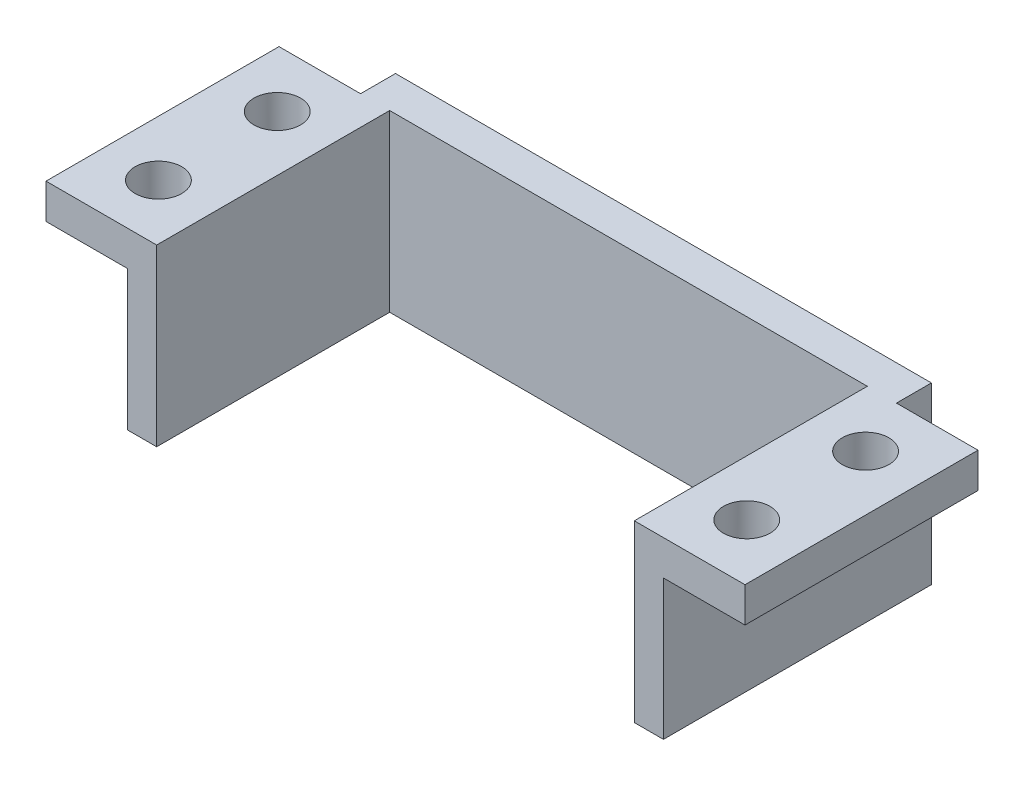
ISO-10303-21;
HEADER;
FILE_DESCRIPTION(('STEP AP214'),'2;1');
FILE_NAME('part.step','',(''),(''),'','','');
FILE_SCHEMA(('AUTOMOTIVE_DESIGN { 1 0 10303 214 1 1 1 1 }'));
ENDSEC;
DATA;
#1=APPLICATION_CONTEXT('core data for automotive mechanical design processes');
#2=APPLICATION_PROTOCOL_DEFINITION('international standard','automotive_design',2000,#1);
#3=PRODUCT_CONTEXT('',#1,'mechanical');
#4=PRODUCT('Part','Part','',(#3));
#5=PRODUCT_RELATED_PRODUCT_CATEGORY('part','',(#4));
#6=PRODUCT_DEFINITION_FORMATION('','',#4);
#7=PRODUCT_DEFINITION_CONTEXT('part definition',#1,'design');
#8=PRODUCT_DEFINITION('design','',#6,#7);
#9=PRODUCT_DEFINITION_SHAPE('','',#8);
#10=(LENGTH_UNIT() NAMED_UNIT(*) SI_UNIT(.MILLI.,.METRE.));
#11=(NAMED_UNIT(*) PLANE_ANGLE_UNIT() SI_UNIT($,.RADIAN.));
#12=(NAMED_UNIT(*) SI_UNIT($,.STERADIAN.) SOLID_ANGLE_UNIT());
#13=UNCERTAINTY_MEASURE_WITH_UNIT(LENGTH_MEASURE(1.E-05),#10,'distance_accuracy_value','');
#14=(GEOMETRIC_REPRESENTATION_CONTEXT(3) GLOBAL_UNCERTAINTY_ASSIGNED_CONTEXT((#13)) GLOBAL_UNIT_ASSIGNED_CONTEXT((#10,
#11,#12)) REPRESENTATION_CONTEXT('',''));
#15=CARTESIAN_POINT('',(0.,0.,0.));
#16=DIRECTION('',(0.,0.,1.));
#17=DIRECTION('',(1.,0.,0.));
#18=AXIS2_PLACEMENT_3D('',#15,#16,#17);
#19=CARTESIAN_POINT('',(0.,0.,3.));
#20=DIRECTION('',(1.,0.,0.));
#21=DIRECTION('',(0.,0.,-1.));
#22=AXIS2_PLACEMENT_3D('',#19,#20,#21);
#23=PLANE('',#22);
#24=DIRECTION('',(0.,0.,1.));
#25=VECTOR('',#24,1.);
#26=CARTESIAN_POINT('',(0.,12.,23.));
#27=LINE('',#26,#25);
#28=CARTESIAN_POINT('',(0.,12.,3.));
#29=VERTEX_POINT('',#28);
#30=CARTESIAN_POINT('',(0.,12.,23.));
#31=VERTEX_POINT('',#30);
#32=EDGE_CURVE('E203',#29,#31,#27,.T.);
#33=ORIENTED_EDGE('',*,*,#32,.F.);
#34=DIRECTION('',(0.,-1.,0.));
#35=VECTOR('',#34,1.);
#36=CARTESIAN_POINT('',(0.,15.,3.));
#37=LINE('',#36,#35);
#38=CARTESIAN_POINT('',(0.,15.,3.));
#39=VERTEX_POINT('',#38);
#40=EDGE_CURVE('E210',#39,#29,#37,.T.);
#41=ORIENTED_EDGE('',*,*,#40,.F.);
#42=DIRECTION('',(0.,0.,-1.));
#43=VECTOR('',#42,1.);
#44=CARTESIAN_POINT('',(0.,15.,3.));
#45=LINE('',#44,#43);
#46=CARTESIAN_POINT('',(0.,15.,0.));
#47=VERTEX_POINT('',#46);
#48=EDGE_CURVE('E246',#39,#47,#45,.T.);
#49=ORIENTED_EDGE('',*,*,#48,.T.);
#50=DIRECTION('',(0.,-1.,0.));
#51=VECTOR('',#50,1.);
#52=CARTESIAN_POINT('',(0.,0.,0.));
#53=LINE('',#52,#51);
#54=CARTESIAN_POINT('',(0.,0.,0.));
#55=VERTEX_POINT('',#54);
#56=EDGE_CURVE('E241',#47,#55,#53,.T.);
#57=ORIENTED_EDGE('',*,*,#56,.T.);
#58=DIRECTION('',(0.,0.,-1.));
#59=VECTOR('',#58,1.);
#60=CARTESIAN_POINT('',(0.,0.,3.));
#61=LINE('',#60,#59);
#62=CARTESIAN_POINT('',(0.,0.,23.));
#63=VERTEX_POINT('',#62);
#64=EDGE_CURVE('E11',#63,#55,#61,.T.);
#65=ORIENTED_EDGE('',*,*,#64,.F.);
#66=DIRECTION('',(0.,-1.,0.));
#67=VECTOR('',#66,1.);
#68=CARTESIAN_POINT('',(0.,0.,23.));
#69=LINE('',#68,#67);
#70=EDGE_CURVE('E225',#31,#63,#69,.T.);
#71=ORIENTED_EDGE('',*,*,#70,.F.);
#72=EDGE_LOOP('',(#33,#41,#49,#57,#65,#71));
#73=FACE_BOUND('',#72,.T.);
#74=ADVANCED_FACE('F39',(#73),#23,.F.);
#75=CARTESIAN_POINT('',(0.,0.,3.));
#76=DIRECTION('',(0.,0.,-1.));
#77=DIRECTION('',(-1.,0.,0.));
#78=AXIS2_PLACEMENT_3D('',#75,#76,#77);
#79=PLANE('',#78);
#80=DIRECTION('',(1.,0.,0.));
#81=VECTOR('',#80,1.);
#82=CARTESIAN_POINT('',(0.,0.,3.));
#83=LINE('',#82,#81);
#84=CARTESIAN_POINT('',(2.5,0.,3.));
#85=VERTEX_POINT('',#84);
#86=CARTESIAN_POINT('',(43.5,0.,3.));
#87=VERTEX_POINT('',#86);
#88=EDGE_CURVE('E63',#85,#87,#83,.T.);
#89=ORIENTED_EDGE('',*,*,#88,.T.);
#90=DIRECTION('',(0.,1.,0.));
#91=VECTOR('',#90,1.);
#92=CARTESIAN_POINT('',(43.5,0.,3.));
#93=LINE('',#92,#91);
#94=CARTESIAN_POINT('',(43.5,15.,3.));
#95=VERTEX_POINT('',#94);
#96=EDGE_CURVE('E150',#87,#95,#93,.T.);
#97=ORIENTED_EDGE('',*,*,#96,.T.);
#98=DIRECTION('',(-1.,0.,0.));
#99=VECTOR('',#98,1.);
#100=CARTESIAN_POINT('',(0.,15.,3.));
#101=LINE('',#100,#99);
#102=CARTESIAN_POINT('',(2.5,15.,3.));
#103=VERTEX_POINT('',#102);
#104=EDGE_CURVE('E243',#95,#103,#101,.T.);
#105=ORIENTED_EDGE('',*,*,#104,.T.);
#106=DIRECTION('',(0.,1.,0.));
#107=VECTOR('',#106,1.);
#108=CARTESIAN_POINT('',(2.5,0.,3.));
#109=LINE('',#108,#107);
#110=EDGE_CURVE('E224',#85,#103,#109,.T.);
#111=ORIENTED_EDGE('',*,*,#110,.F.);
#112=EDGE_LOOP('',(#89,#97,#105,#111));
#113=FACE_BOUND('',#112,.T.);
#114=ADVANCED_FACE('F295',(#113),#79,.F.);
#115=CARTESIAN_POINT('',(0.,0.,3.));
#116=DIRECTION('',(0.,1.,0.));
#117=DIRECTION('',(0.,0.,1.));
#118=AXIS2_PLACEMENT_3D('',#115,#116,#117);
#119=PLANE('',#118);
#120=DIRECTION('',(1.,0.,0.));
#121=VECTOR('',#120,1.);
#122=CARTESIAN_POINT('',(0.,0.,0.));
#123=LINE('',#122,#121);
#124=CARTESIAN_POINT('',(46.,0.,0.));
#125=VERTEX_POINT('',#124);
#126=EDGE_CURVE('E249',#55,#125,#123,.T.);
#127=ORIENTED_EDGE('',*,*,#126,.T.);
#128=DIRECTION('',(0.,0.,-1.));
#129=VECTOR('',#128,1.);
#130=CARTESIAN_POINT('',(46.,0.,3.));
#131=LINE('',#130,#129);
#132=CARTESIAN_POINT('',(46.,0.,23.));
#133=VERTEX_POINT('',#132);
#134=EDGE_CURVE('E47',#133,#125,#131,.T.);
#135=ORIENTED_EDGE('',*,*,#134,.F.);
#136=DIRECTION('',(-1.,0.,0.));
#137=VECTOR('',#136,1.);
#138=CARTESIAN_POINT('',(46.,0.,23.));
#139=LINE('',#138,#137);
#140=CARTESIAN_POINT('',(43.5,0.,23.));
#141=VERTEX_POINT('',#140);
#142=EDGE_CURVE('E183',#133,#141,#139,.T.);
#143=ORIENTED_EDGE('',*,*,#142,.T.);
#144=DIRECTION('',(0.,0.,-1.));
#145=VECTOR('',#144,1.);
#146=CARTESIAN_POINT('',(43.5,0.,23.));
#147=LINE('',#146,#145);
#148=EDGE_CURVE('E186',#141,#87,#147,.T.);
#149=ORIENTED_EDGE('',*,*,#148,.T.);
#150=ORIENTED_EDGE('',*,*,#88,.F.);
#151=DIRECTION('',(0.,0.,-1.));
#152=VECTOR('',#151,1.);
#153=CARTESIAN_POINT('',(2.5,0.,23.));
#154=LINE('',#153,#152);
#155=CARTESIAN_POINT('',(2.5,0.,23.));
#156=VERTEX_POINT('',#155);
#157=EDGE_CURVE('E238',#156,#85,#154,.T.);
#158=ORIENTED_EDGE('',*,*,#157,.F.);
#159=DIRECTION('',(1.,0.,0.));
#160=VECTOR('',#159,1.);
#161=CARTESIAN_POINT('',(0.,0.,23.));
#162=LINE('',#161,#160);
#163=EDGE_CURVE('E227',#63,#156,#162,.T.);
#164=ORIENTED_EDGE('',*,*,#163,.F.);
#165=ORIENTED_EDGE('',*,*,#64,.T.);
#166=EDGE_LOOP('',(#127,#135,#143,#149,#150,#158,#164,#165));
#167=FACE_BOUND('',#166,.T.);
#168=ADVANCED_FACE('F302',(#167),#119,.F.);
#169=CARTESIAN_POINT('',(46.,0.,3.));
#170=DIRECTION('',(-1.,0.,0.));
#171=DIRECTION('',(0.,0.,1.));
#172=AXIS2_PLACEMENT_3D('',#169,#170,#171);
#173=PLANE('',#172);
#174=DIRECTION('',(0.,0.,-1.));
#175=VECTOR('',#174,1.);
#176=CARTESIAN_POINT('',(46.,15.,3.));
#177=LINE('',#176,#175);
#178=CARTESIAN_POINT('',(46.,15.,3.));
#179=VERTEX_POINT('',#178);
#180=CARTESIAN_POINT('',(46.,15.,0.));
#181=VERTEX_POINT('',#180);
#182=EDGE_CURVE('E257',#179,#181,#177,.T.);
#183=ORIENTED_EDGE('',*,*,#182,.F.);
#184=DIRECTION('',(0.,-1.,0.));
#185=VECTOR('',#184,1.);
#186=CARTESIAN_POINT('',(46.,15.,3.));
#187=LINE('',#186,#185);
#188=CARTESIAN_POINT('',(46.,12.,3.));
#189=VERTEX_POINT('',#188);
#190=EDGE_CURVE('E161',#179,#189,#187,.T.);
#191=ORIENTED_EDGE('',*,*,#190,.T.);
#192=DIRECTION('',(0.,0.,1.));
#193=VECTOR('',#192,1.);
#194=CARTESIAN_POINT('',(46.,12.,23.));
#195=LINE('',#194,#193);
#196=CARTESIAN_POINT('',(46.,12.,23.));
#197=VERTEX_POINT('',#196);
#198=EDGE_CURVE('E171',#189,#197,#195,.T.);
#199=ORIENTED_EDGE('',*,*,#198,.T.);
#200=DIRECTION('',(0.,-1.,0.));
#201=VECTOR('',#200,1.);
#202=CARTESIAN_POINT('',(46.,0.,23.));
#203=LINE('',#202,#201);
#204=EDGE_CURVE('E149',#197,#133,#203,.T.);
#205=ORIENTED_EDGE('',*,*,#204,.T.);
#206=ORIENTED_EDGE('',*,*,#134,.T.);
#207=DIRECTION('',(0.,1.,0.));
#208=VECTOR('',#207,1.);
#209=CARTESIAN_POINT('',(46.,0.,0.));
#210=LINE('',#209,#208);
#211=EDGE_CURVE('E251',#125,#181,#210,.T.);
#212=ORIENTED_EDGE('',*,*,#211,.T.);
#213=EDGE_LOOP('',(#183,#191,#199,#205,#206,#212));
#214=FACE_BOUND('',#213,.T.);
#215=ADVANCED_FACE('F344',(#214),#173,.F.);
#216=CARTESIAN_POINT('',(0.,15.,3.));
#217=DIRECTION('',(0.,-1.,0.));
#218=DIRECTION('',(0.,0.,-1.));
#219=AXIS2_PLACEMENT_3D('',#216,#217,#218);
#220=PLANE('',#219);
#221=CARTESIAN_POINT('',(48.25,15.,18.1));
#222=DIRECTION('',(0.,-1.,0.));
#223=DIRECTION('',(0.,0.,1.));
#224=AXIS2_PLACEMENT_3D('',#221,#222,#223);
#225=CIRCLE('',#224,2.);
#226=CARTESIAN_POINT('',(48.25,15.,20.1));
#227=VERTEX_POINT('',#226);
#228=EDGE_CURVE('E266',#227,#227,#225,.T.);
#229=ORIENTED_EDGE('',*,*,#228,.T.);
#230=EDGE_LOOP('',(#229));
#231=FACE_BOUND('',#230,.T.);
#232=CARTESIAN_POINT('',(48.25,15.,7.9));
#233=DIRECTION('',(0.,-1.,0.));
#234=DIRECTION('',(0.,0.,-1.));
#235=AXIS2_PLACEMENT_3D('',#232,#233,#234);
#236=CIRCLE('',#235,2.);
#237=CARTESIAN_POINT('',(48.25,15.,5.9));
#238=VERTEX_POINT('',#237);
#239=EDGE_CURVE('E271',#238,#238,#236,.T.);
#240=ORIENTED_EDGE('',*,*,#239,.T.);
#241=EDGE_LOOP('',(#240));
#242=FACE_BOUND('',#241,.T.);
#243=CARTESIAN_POINT('',(-2.25,15.,18.1));
#244=DIRECTION('',(0.,1.,0.));
#245=DIRECTION('',(0.,0.,1.));
#246=AXIS2_PLACEMENT_3D('',#243,#244,#245);
#247=CIRCLE('',#246,2.);
#248=CARTESIAN_POINT('',(-2.25,15.,20.1));
#249=VERTEX_POINT('',#248);
#250=EDGE_CURVE('E193',#249,#249,#247,.T.);
#251=ORIENTED_EDGE('',*,*,#250,.F.);
#252=EDGE_LOOP('',(#251));
#253=FACE_BOUND('',#252,.T.);
#254=CARTESIAN_POINT('',(-2.25,15.,7.9));
#255=DIRECTION('',(0.,1.,0.));
#256=DIRECTION('',(0.,0.,-1.));
#257=AXIS2_PLACEMENT_3D('',#254,#255,#256);
#258=CIRCLE('',#257,2.);
#259=CARTESIAN_POINT('',(-2.25,15.,5.9));
#260=VERTEX_POINT('',#259);
#261=EDGE_CURVE('E192',#260,#260,#258,.T.);
#262=ORIENTED_EDGE('',*,*,#261,.F.);
#263=EDGE_LOOP('',(#262));
#264=FACE_BOUND('',#263,.T.);
#265=DIRECTION('',(-1.,0.,0.));
#266=VECTOR('',#265,1.);
#267=CARTESIAN_POINT('',(0.,15.,0.));
#268=LINE('',#267,#266);
#269=EDGE_CURVE('E244',#181,#47,#268,.T.);
#270=ORIENTED_EDGE('',*,*,#269,.T.);
#271=ORIENTED_EDGE('',*,*,#48,.F.);
#272=DIRECTION('',(1.,0.,0.));
#273=VECTOR('',#272,1.);
#274=CARTESIAN_POINT('',(-7.,15.,3.));
#275=LINE('',#274,#273);
#276=CARTESIAN_POINT('',(-7.,15.,3.));
#277=VERTEX_POINT('',#276);
#278=EDGE_CURVE('E221',#277,#39,#275,.T.);
#279=ORIENTED_EDGE('',*,*,#278,.F.);
#280=DIRECTION('',(0.,0.,-1.));
#281=VECTOR('',#280,1.);
#282=CARTESIAN_POINT('',(-7.,15.,23.));
#283=LINE('',#282,#281);
#284=CARTESIAN_POINT('',(-7.,15.,23.));
#285=VERTEX_POINT('',#284);
#286=EDGE_CURVE('E202',#285,#277,#283,.T.);
#287=ORIENTED_EDGE('',*,*,#286,.F.);
#288=DIRECTION('',(-1.,0.,0.));
#289=VECTOR('',#288,1.);
#290=CARTESIAN_POINT('',(0.,15.,23.));
#291=LINE('',#290,#289);
#292=CARTESIAN_POINT('',(2.5,15.,23.));
#293=VERTEX_POINT('',#292);
#294=EDGE_CURVE('E231',#293,#285,#291,.T.);
#295=ORIENTED_EDGE('',*,*,#294,.F.);
#296=DIRECTION('',(0.,0.,-1.));
#297=VECTOR('',#296,1.);
#298=CARTESIAN_POINT('',(2.5,15.,23.));
#299=LINE('',#298,#297);
#300=EDGE_CURVE('E233',#293,#103,#299,.T.);
#301=ORIENTED_EDGE('',*,*,#300,.T.);
#302=ORIENTED_EDGE('',*,*,#104,.F.);
#303=DIRECTION('',(0.,0.,-1.));
#304=VECTOR('',#303,1.);
#305=CARTESIAN_POINT('',(43.5,15.,23.));
#306=LINE('',#305,#304);
#307=CARTESIAN_POINT('',(43.5,15.,23.));
#308=VERTEX_POINT('',#307);
#309=EDGE_CURVE('E189',#308,#95,#306,.T.);
#310=ORIENTED_EDGE('',*,*,#309,.F.);
#311=DIRECTION('',(1.,0.,0.));
#312=VECTOR('',#311,1.);
#313=CARTESIAN_POINT('',(46.,15.,23.));
#314=LINE('',#313,#312);
#315=CARTESIAN_POINT('',(53.,15.,23.));
#316=VERTEX_POINT('',#315);
#317=EDGE_CURVE('E178',#308,#316,#314,.T.);
#318=ORIENTED_EDGE('',*,*,#317,.T.);
#319=DIRECTION('',(0.,0.,-1.));
#320=VECTOR('',#319,1.);
#321=CARTESIAN_POINT('',(53.,15.,23.));
#322=LINE('',#321,#320);
#323=CARTESIAN_POINT('',(53.,15.,3.));
#324=VERTEX_POINT('',#323);
#325=EDGE_CURVE('E160',#316,#324,#322,.T.);
#326=ORIENTED_EDGE('',*,*,#325,.T.);
#327=DIRECTION('',(-1.,0.,0.));
#328=VECTOR('',#327,1.);
#329=CARTESIAN_POINT('',(53.,15.,3.));
#330=LINE('',#329,#328);
#331=EDGE_CURVE('E170',#324,#179,#330,.T.);
#332=ORIENTED_EDGE('',*,*,#331,.T.);
#333=ORIENTED_EDGE('',*,*,#182,.T.);
#334=EDGE_LOOP('',(#270,#271,#279,#287,#295,#301,#302,#310,#318,#326,#332,#333));
#335=FACE_BOUND('',#334,.T.);
#336=ADVANCED_FACE('F278',(#231,#242,#253,#264,#335),#220,.F.);
#337=CARTESIAN_POINT('',(0.,0.,0.));
#338=DIRECTION('',(0.,0.,-1.));
#339=DIRECTION('',(-1.,0.,0.));
#340=AXIS2_PLACEMENT_3D('',#337,#338,#339);
#341=PLANE('',#340);
#342=ORIENTED_EDGE('',*,*,#56,.F.);
#343=ORIENTED_EDGE('',*,*,#269,.F.);
#344=ORIENTED_EDGE('',*,*,#211,.F.);
#345=ORIENTED_EDGE('',*,*,#126,.F.);
#346=EDGE_LOOP('',(#342,#343,#344,#345));
#347=FACE_BOUND('',#346,.T.);
#348=ADVANCED_FACE('F325',(#347),#341,.T.);
#349=CARTESIAN_POINT('',(2.5,0.,23.));
#350=DIRECTION('',(-1.,0.,0.));
#351=DIRECTION('',(0.,0.,1.));
#352=AXIS2_PLACEMENT_3D('',#349,#350,#351);
#353=PLANE('',#352);
#354=ORIENTED_EDGE('',*,*,#110,.T.);
#355=ORIENTED_EDGE('',*,*,#300,.F.);
#356=DIRECTION('',(0.,1.,0.));
#357=VECTOR('',#356,1.);
#358=CARTESIAN_POINT('',(2.5,0.,23.));
#359=LINE('',#358,#357);
#360=EDGE_CURVE('E229',#156,#293,#359,.T.);
#361=ORIENTED_EDGE('',*,*,#360,.F.);
#362=ORIENTED_EDGE('',*,*,#157,.T.);
#363=EDGE_LOOP('',(#354,#355,#361,#362));
#364=FACE_BOUND('',#363,.T.);
#365=ADVANCED_FACE('F335',(#364),#353,.F.);
#366=CARTESIAN_POINT('',(0.,0.,23.));
#367=DIRECTION('',(0.,0.,-1.));
#368=DIRECTION('',(-1.,0.,0.));
#369=AXIS2_PLACEMENT_3D('',#366,#367,#368);
#370=PLANE('',#369);
#371=ORIENTED_EDGE('',*,*,#294,.T.);
#372=DIRECTION('',(0.,1.,0.));
#373=VECTOR('',#372,1.);
#374=CARTESIAN_POINT('',(-7.,15.,23.));
#375=LINE('',#374,#373);
#376=CARTESIAN_POINT('',(-7.,12.,23.));
#377=VERTEX_POINT('',#376);
#378=EDGE_CURVE('E199',#377,#285,#375,.T.);
#379=ORIENTED_EDGE('',*,*,#378,.F.);
#380=DIRECTION('',(1.,0.,0.));
#381=VECTOR('',#380,1.);
#382=CARTESIAN_POINT('',(-7.,12.,23.));
#383=LINE('',#382,#381);
#384=EDGE_CURVE('E209',#377,#31,#383,.T.);
#385=ORIENTED_EDGE('',*,*,#384,.T.);
#386=ORIENTED_EDGE('',*,*,#70,.T.);
#387=ORIENTED_EDGE('',*,*,#163,.T.);
#388=ORIENTED_EDGE('',*,*,#360,.T.);
#389=EDGE_LOOP('',(#371,#379,#385,#386,#387,#388));
#390=FACE_BOUND('',#389,.T.);
#391=ADVANCED_FACE('F332',(#390),#370,.F.);
#392=CARTESIAN_POINT('',(-7.,15.,3.));
#393=DIRECTION('',(0.,0.,1.));
#394=DIRECTION('',(1.,0.,0.));
#395=AXIS2_PLACEMENT_3D('',#392,#393,#394);
#396=PLANE('',#395);
#397=ORIENTED_EDGE('',*,*,#40,.T.);
#398=DIRECTION('',(1.,0.,0.));
#399=VECTOR('',#398,1.);
#400=CARTESIAN_POINT('',(-7.,12.,3.));
#401=LINE('',#400,#399);
#402=CARTESIAN_POINT('',(-7.,12.,3.));
#403=VERTEX_POINT('',#402);
#404=EDGE_CURVE('E218',#403,#29,#401,.T.);
#405=ORIENTED_EDGE('',*,*,#404,.F.);
#406=DIRECTION('',(0.,-1.,0.));
#407=VECTOR('',#406,1.);
#408=CARTESIAN_POINT('',(-7.,15.,3.));
#409=LINE('',#408,#407);
#410=EDGE_CURVE('E205',#277,#403,#409,.T.);
#411=ORIENTED_EDGE('',*,*,#410,.F.);
#412=ORIENTED_EDGE('',*,*,#278,.T.);
#413=EDGE_LOOP('',(#397,#405,#411,#412));
#414=FACE_BOUND('',#413,.T.);
#415=ADVANCED_FACE('F310',(#414),#396,.F.);
#416=CARTESIAN_POINT('',(-7.,12.,23.));
#417=DIRECTION('',(0.,1.,0.));
#418=DIRECTION('',(0.,0.,1.));
#419=AXIS2_PLACEMENT_3D('',#416,#417,#418);
#420=PLANE('',#419);
#421=CARTESIAN_POINT('',(-2.25,12.,18.1));
#422=DIRECTION('',(0.,1.,0.));
#423=DIRECTION('',(0.,0.,1.));
#424=AXIS2_PLACEMENT_3D('',#421,#422,#423);
#425=CIRCLE('',#424,2.);
#426=CARTESIAN_POINT('',(-2.25,12.,20.1));
#427=VERTEX_POINT('',#426);
#428=EDGE_CURVE('E213',#427,#427,#425,.T.);
#429=ORIENTED_EDGE('',*,*,#428,.T.);
#430=EDGE_LOOP('',(#429));
#431=FACE_BOUND('',#430,.T.);
#432=CARTESIAN_POINT('',(-2.25,12.,7.9));
#433=DIRECTION('',(0.,1.,0.));
#434=DIRECTION('',(0.,0.,1.));
#435=AXIS2_PLACEMENT_3D('',#432,#433,#434);
#436=CIRCLE('',#435,2.);
#437=CARTESIAN_POINT('',(-2.25,12.,9.9));
#438=VERTEX_POINT('',#437);
#439=EDGE_CURVE('E196',#438,#438,#436,.T.);
#440=ORIENTED_EDGE('',*,*,#439,.T.);
#441=EDGE_LOOP('',(#440));
#442=FACE_BOUND('',#441,.T.);
#443=ORIENTED_EDGE('',*,*,#32,.T.);
#444=ORIENTED_EDGE('',*,*,#384,.F.);
#445=DIRECTION('',(0.,0.,1.));
#446=VECTOR('',#445,1.);
#447=CARTESIAN_POINT('',(-7.,12.,23.));
#448=LINE('',#447,#446);
#449=EDGE_CURVE('E207',#403,#377,#448,.T.);
#450=ORIENTED_EDGE('',*,*,#449,.F.);
#451=ORIENTED_EDGE('',*,*,#404,.T.);
#452=EDGE_LOOP('',(#443,#444,#450,#451));
#453=FACE_BOUND('',#452,.T.);
#454=ADVANCED_FACE('F314',(#431,#442,#453),#420,.F.);
#455=CARTESIAN_POINT('',(-7.,0.,0.));
#456=DIRECTION('',(1.,0.,0.));
#457=DIRECTION('',(0.,0.,-1.));
#458=AXIS2_PLACEMENT_3D('',#455,#456,#457);
#459=PLANE('',#458);
#460=ORIENTED_EDGE('',*,*,#378,.T.);
#461=ORIENTED_EDGE('',*,*,#286,.T.);
#462=ORIENTED_EDGE('',*,*,#410,.T.);
#463=ORIENTED_EDGE('',*,*,#449,.T.);
#464=EDGE_LOOP('',(#460,#461,#462,#463));
#465=FACE_BOUND('',#464,.T.);
#466=ADVANCED_FACE('F317',(#465),#459,.F.);
#467=CARTESIAN_POINT('',(-2.25,8.,7.9));
#468=DIRECTION('',(0.,1.,0.));
#469=DIRECTION('',(0.,0.,1.));
#470=AXIS2_PLACEMENT_3D('',#467,#468,#469);
#471=CYLINDRICAL_SURFACE('',#470,2.);
#472=ORIENTED_EDGE('',*,*,#261,.T.);
#473=EDGE_LOOP('',(#472));
#474=FACE_BOUND('',#473,.T.);
#475=ORIENTED_EDGE('',*,*,#439,.F.);
#476=EDGE_LOOP('',(#475));
#477=FACE_BOUND('',#476,.T.);
#478=ADVANCED_FACE('F364',(#474,#477),#471,.F.);
#479=CARTESIAN_POINT('',(-2.25,8.,18.1));
#480=DIRECTION('',(0.,1.,0.));
#481=DIRECTION('',(0.,0.,1.));
#482=AXIS2_PLACEMENT_3D('',#479,#480,#481);
#483=CYLINDRICAL_SURFACE('',#482,2.);
#484=ORIENTED_EDGE('',*,*,#250,.T.);
#485=EDGE_LOOP('',(#484));
#486=FACE_BOUND('',#485,.T.);
#487=ORIENTED_EDGE('',*,*,#428,.F.);
#488=EDGE_LOOP('',(#487));
#489=FACE_BOUND('',#488,.T.);
#490=ADVANCED_FACE('F367',(#486,#489),#483,.F.);
#491=CARTESIAN_POINT('',(43.5,0.,23.));
#492=DIRECTION('',(-1.,0.,0.));
#493=DIRECTION('',(0.,0.,1.));
#494=AXIS2_PLACEMENT_3D('',#491,#492,#493);
#495=PLANE('',#494);
#496=ORIENTED_EDGE('',*,*,#96,.F.);
#497=ORIENTED_EDGE('',*,*,#148,.F.);
#498=DIRECTION('',(0.,1.,0.));
#499=VECTOR('',#498,1.);
#500=CARTESIAN_POINT('',(43.5,0.,23.));
#501=LINE('',#500,#499);
#502=EDGE_CURVE('E180',#141,#308,#501,.T.);
#503=ORIENTED_EDGE('',*,*,#502,.T.);
#504=ORIENTED_EDGE('',*,*,#309,.T.);
#505=EDGE_LOOP('',(#496,#497,#503,#504));
#506=FACE_BOUND('',#505,.T.);
#507=ADVANCED_FACE('F339',(#506),#495,.T.);
#508=CARTESIAN_POINT('',(46.,0.,23.));
#509=DIRECTION('',(0.,0.,-1.));
#510=DIRECTION('',(1.,0.,0.));
#511=AXIS2_PLACEMENT_3D('',#508,#509,#510);
#512=PLANE('',#511);
#513=ORIENTED_EDGE('',*,*,#204,.F.);
#514=DIRECTION('',(-1.,0.,0.));
#515=VECTOR('',#514,1.);
#516=CARTESIAN_POINT('',(53.,12.,23.));
#517=LINE('',#516,#515);
#518=CARTESIAN_POINT('',(53.,12.,23.));
#519=VERTEX_POINT('',#518);
#520=EDGE_CURVE('E55',#519,#197,#517,.T.);
#521=ORIENTED_EDGE('',*,*,#520,.F.);
#522=DIRECTION('',(0.,1.,0.));
#523=VECTOR('',#522,1.);
#524=CARTESIAN_POINT('',(53.,15.,23.));
#525=LINE('',#524,#523);
#526=EDGE_CURVE('E146',#519,#316,#525,.T.);
#527=ORIENTED_EDGE('',*,*,#526,.T.);
#528=ORIENTED_EDGE('',*,*,#317,.F.);
#529=ORIENTED_EDGE('',*,*,#502,.F.);
#530=ORIENTED_EDGE('',*,*,#142,.F.);
#531=EDGE_LOOP('',(#513,#521,#527,#528,#529,#530));
#532=FACE_BOUND('',#531,.T.);
#533=ADVANCED_FACE('F144',(#532),#512,.F.);
#534=CARTESIAN_POINT('',(53.,12.,23.));
#535=DIRECTION('',(0.,-1.,0.));
#536=DIRECTION('',(0.,0.,-1.));
#537=AXIS2_PLACEMENT_3D('',#534,#535,#536);
#538=PLANE('',#537);
#539=CARTESIAN_POINT('',(48.25,12.,18.1));
#540=DIRECTION('',(0.,-1.,0.));
#541=DIRECTION('',(0.,0.,-1.));
#542=AXIS2_PLACEMENT_3D('',#539,#540,#541);
#543=CIRCLE('',#542,2.);
#544=CARTESIAN_POINT('',(48.25,12.,16.1));
#545=VERTEX_POINT('',#544);
#546=EDGE_CURVE('E42',#545,#545,#543,.F.);
#547=ORIENTED_EDGE('',*,*,#546,.T.);
#548=EDGE_LOOP('',(#547));
#549=FACE_BOUND('',#548,.T.);
#550=CARTESIAN_POINT('',(48.25,12.,7.9));
#551=DIRECTION('',(0.,-1.,0.));
#552=DIRECTION('',(0.,0.,-1.));
#553=AXIS2_PLACEMENT_3D('',#550,#551,#552);
#554=CIRCLE('',#553,2.);
#555=CARTESIAN_POINT('',(48.25,12.,5.9));
#556=VERTEX_POINT('',#555);
#557=EDGE_CURVE('E264',#556,#556,#554,.F.);
#558=ORIENTED_EDGE('',*,*,#557,.T.);
#559=EDGE_LOOP('',(#558));
#560=FACE_BOUND('',#559,.T.);
#561=ORIENTED_EDGE('',*,*,#198,.F.);
#562=DIRECTION('',(-1.,0.,0.));
#563=VECTOR('',#562,1.);
#564=CARTESIAN_POINT('',(53.,12.,3.));
#565=LINE('',#564,#563);
#566=CARTESIAN_POINT('',(53.,12.,3.));
#567=VERTEX_POINT('',#566);
#568=EDGE_CURVE('E151',#567,#189,#565,.T.);
#569=ORIENTED_EDGE('',*,*,#568,.F.);
#570=DIRECTION('',(0.,0.,1.));
#571=VECTOR('',#570,1.);
#572=CARTESIAN_POINT('',(53.,12.,23.));
#573=LINE('',#572,#571);
#574=EDGE_CURVE('E157',#567,#519,#573,.T.);
#575=ORIENTED_EDGE('',*,*,#574,.T.);
#576=ORIENTED_EDGE('',*,*,#520,.T.);
#577=EDGE_LOOP('',(#561,#569,#575,#576));
#578=FACE_BOUND('',#577,.T.);
#579=ADVANCED_FACE('F163',(#549,#560,#578),#538,.T.);
#580=CARTESIAN_POINT('',(53.,15.,3.));
#581=DIRECTION('',(0.,0.,-1.));
#582=DIRECTION('',(-1.,0.,0.));
#583=AXIS2_PLACEMENT_3D('',#580,#581,#582);
#584=PLANE('',#583);
#585=ORIENTED_EDGE('',*,*,#190,.F.);
#586=ORIENTED_EDGE('',*,*,#331,.F.);
#587=DIRECTION('',(0.,-1.,0.));
#588=VECTOR('',#587,1.);
#589=CARTESIAN_POINT('',(53.,15.,3.));
#590=LINE('',#589,#588);
#591=EDGE_CURVE('E164',#324,#567,#590,.T.);
#592=ORIENTED_EDGE('',*,*,#591,.T.);
#593=ORIENTED_EDGE('',*,*,#568,.T.);
#594=EDGE_LOOP('',(#585,#586,#592,#593));
#595=FACE_BOUND('',#594,.T.);
#596=ADVANCED_FACE('F292',(#595),#584,.T.);
#597=CARTESIAN_POINT('',(53.,0.,0.));
#598=DIRECTION('',(-1.,0.,0.));
#599=DIRECTION('',(0.,0.,-1.));
#600=AXIS2_PLACEMENT_3D('',#597,#598,#599);
#601=PLANE('',#600);
#602=ORIENTED_EDGE('',*,*,#526,.F.);
#603=ORIENTED_EDGE('',*,*,#574,.F.);
#604=ORIENTED_EDGE('',*,*,#591,.F.);
#605=ORIENTED_EDGE('',*,*,#325,.F.);
#606=EDGE_LOOP('',(#602,#603,#604,#605));
#607=FACE_BOUND('',#606,.T.);
#608=ADVANCED_FACE('F155',(#607),#601,.F.);
#609=CARTESIAN_POINT('',(48.25,8.,7.9));
#610=DIRECTION('',(0.,1.,0.));
#611=DIRECTION('',(0.,0.,1.));
#612=AXIS2_PLACEMENT_3D('',#609,#610,#611);
#613=CYLINDRICAL_SURFACE('',#612,2.);
#614=ORIENTED_EDGE('',*,*,#557,.F.);
#615=EDGE_LOOP('',(#614));
#616=FACE_BOUND('',#615,.T.);
#617=ORIENTED_EDGE('',*,*,#239,.F.);
#618=EDGE_LOOP('',(#617));
#619=FACE_BOUND('',#618,.T.);
#620=ADVANCED_FACE('F281',(#616,#619),#613,.F.);
#621=CARTESIAN_POINT('',(48.25,8.,18.1));
#622=DIRECTION('',(0.,1.,0.));
#623=DIRECTION('',(0.,0.,1.));
#624=AXIS2_PLACEMENT_3D('',#621,#622,#623);
#625=CYLINDRICAL_SURFACE('',#624,2.);
#626=ORIENTED_EDGE('',*,*,#546,.F.);
#627=EDGE_LOOP('',(#626));
#628=FACE_BOUND('',#627,.T.);
#629=ORIENTED_EDGE('',*,*,#228,.F.);
#630=EDGE_LOOP('',(#629));
#631=FACE_BOUND('',#630,.T.);
#632=ADVANCED_FACE('F283',(#628,#631),#625,.F.);
#633=CLOSED_SHELL('',(#74,#114,#168,#215,#336,#348,#365,#391,#415,#454,#466,#478,#490,#507,#533,
#579,#596,#608,#620,#632));
#634=MANIFOLD_SOLID_BREP('B2',#633);
#635=ADVANCED_BREP_SHAPE_REPRESENTATION('',(#18,#634),#14);
#636=SHAPE_DEFINITION_REPRESENTATION(#9,#635);
ENDSEC;
END-ISO-10303-21;
